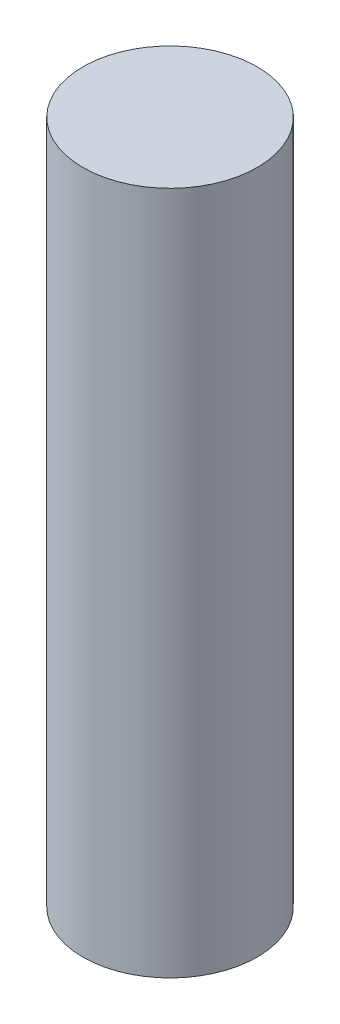
ISO-10303-21;
HEADER;
FILE_DESCRIPTION(('STEP AP214'),'2;1');
FILE_NAME('part.step','',(''),(''),'','','');
FILE_SCHEMA(('AUTOMOTIVE_DESIGN { 1 0 10303 214 1 1 1 1 }'));
ENDSEC;
DATA;
#1=APPLICATION_CONTEXT('core data for automotive mechanical design processes');
#2=APPLICATION_PROTOCOL_DEFINITION('international standard','automotive_design',2000,#1);
#3=PRODUCT_CONTEXT('',#1,'mechanical');
#4=PRODUCT('Part','Part','',(#3));
#5=PRODUCT_RELATED_PRODUCT_CATEGORY('part','',(#4));
#6=PRODUCT_DEFINITION_FORMATION('','',#4);
#7=PRODUCT_DEFINITION_CONTEXT('part definition',#1,'design');
#8=PRODUCT_DEFINITION('design','',#6,#7);
#9=PRODUCT_DEFINITION_SHAPE('','',#8);
#10=(LENGTH_UNIT() NAMED_UNIT(*) SI_UNIT(.MILLI.,.METRE.));
#11=(NAMED_UNIT(*) PLANE_ANGLE_UNIT() SI_UNIT($,.RADIAN.));
#12=(NAMED_UNIT(*) SI_UNIT($,.STERADIAN.) SOLID_ANGLE_UNIT());
#13=UNCERTAINTY_MEASURE_WITH_UNIT(LENGTH_MEASURE(1.E-05),#10,'distance_accuracy_value','');
#14=(GEOMETRIC_REPRESENTATION_CONTEXT(3) GLOBAL_UNCERTAINTY_ASSIGNED_CONTEXT((#13)) GLOBAL_UNIT_ASSIGNED_CONTEXT((#10,
#11,#12)) REPRESENTATION_CONTEXT('',''));
#15=CARTESIAN_POINT('',(0.,0.,0.));
#16=DIRECTION('',(0.,0.,1.));
#17=DIRECTION('',(1.,0.,0.));
#18=AXIS2_PLACEMENT_3D('',#15,#16,#17);
#19=CARTESIAN_POINT('',(0.,100.,0.));
#20=DIRECTION('',(0.,-1.,0.));
#21=DIRECTION('',(0.,0.,-1.));
#22=AXIS2_PLACEMENT_3D('',#19,#20,#21);
#23=CYLINDRICAL_SURFACE('',#22,12.75);
#24=CARTESIAN_POINT('',(0.,100.,0.));
#25=DIRECTION('',(0.,1.,0.));
#26=DIRECTION('',(0.,0.,1.));
#27=AXIS2_PLACEMENT_3D('',#24,#25,#26);
#28=CIRCLE('',#27,12.75);
#29=CARTESIAN_POINT('',(0.,100.,12.75));
#30=VERTEX_POINT('',#29);
#31=EDGE_CURVE('E10',#30,#30,#28,.T.);
#32=ORIENTED_EDGE('',*,*,#31,.F.);
#33=EDGE_LOOP('',(#32));
#34=FACE_BOUND('',#33,.T.);
#35=CARTESIAN_POINT('',(0.,0.,0.));
#36=DIRECTION('',(0.,1.,0.));
#37=DIRECTION('',(0.,0.,1.));
#38=AXIS2_PLACEMENT_3D('',#35,#36,#37);
#39=CIRCLE('',#38,12.75);
#40=CARTESIAN_POINT('',(0.,0.,12.75));
#41=VERTEX_POINT('',#40);
#42=EDGE_CURVE('E34',#41,#41,#39,.T.);
#43=ORIENTED_EDGE('',*,*,#42,.T.);
#44=EDGE_LOOP('',(#43));
#45=FACE_BOUND('',#44,.T.);
#46=ADVANCED_FACE('F31',(#34,#45),#23,.T.);
#47=CARTESIAN_POINT('',(0.,100.,0.));
#48=DIRECTION('',(0.,1.,0.));
#49=DIRECTION('',(0.,0.,1.));
#50=AXIS2_PLACEMENT_3D('',#47,#48,#49);
#51=PLANE('',#50);
#52=ORIENTED_EDGE('',*,*,#31,.T.);
#53=EDGE_LOOP('',(#52));
#54=FACE_BOUND('',#53,.T.);
#55=ADVANCED_FACE('F46',(#54),#51,.T.);
#56=CARTESIAN_POINT('',(0.,0.,0.));
#57=DIRECTION('',(0.,1.,0.));
#58=DIRECTION('',(0.,0.,1.));
#59=AXIS2_PLACEMENT_3D('',#56,#57,#58);
#60=PLANE('',#59);
#61=ORIENTED_EDGE('',*,*,#42,.F.);
#62=EDGE_LOOP('',(#61));
#63=FACE_BOUND('',#62,.T.);
#64=ADVANCED_FACE('F44',(#63),#60,.F.);
#65=CLOSED_SHELL('',(#46,#55,#64));
#66=MANIFOLD_SOLID_BREP('B2',#65);
#67=ADVANCED_BREP_SHAPE_REPRESENTATION('',(#18,#66),#14);
#68=SHAPE_DEFINITION_REPRESENTATION(#9,#67);
ENDSEC;
END-ISO-10303-21;
